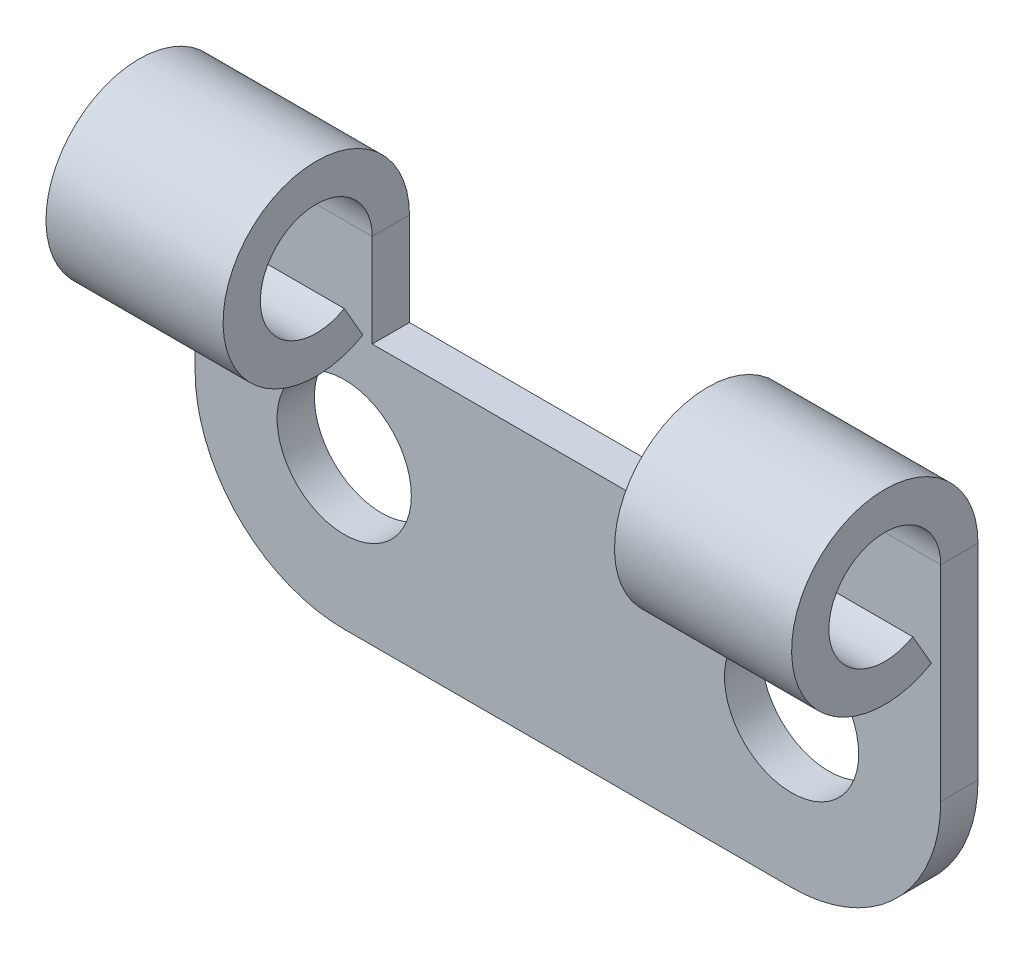
ISO-10303-21;
HEADER;
FILE_DESCRIPTION(('STEP AP214'),'2;1');
FILE_NAME('part.step','',(''),(''),'','','');
FILE_SCHEMA(('AUTOMOTIVE_DESIGN { 1 0 10303 214 1 1 1 1 }'));
ENDSEC;
DATA;
#1=APPLICATION_CONTEXT('core data for automotive mechanical design processes');
#2=APPLICATION_PROTOCOL_DEFINITION('international standard','automotive_design',2000,#1);
#3=PRODUCT_CONTEXT('',#1,'mechanical');
#4=PRODUCT('Part','Part','',(#3));
#5=PRODUCT_RELATED_PRODUCT_CATEGORY('part','',(#4));
#6=PRODUCT_DEFINITION_FORMATION('','',#4);
#7=PRODUCT_DEFINITION_CONTEXT('part definition',#1,'design');
#8=PRODUCT_DEFINITION('design','',#6,#7);
#9=PRODUCT_DEFINITION_SHAPE('','',#8);
#10=(LENGTH_UNIT() NAMED_UNIT(*) SI_UNIT(.MILLI.,.METRE.));
#11=(NAMED_UNIT(*) PLANE_ANGLE_UNIT() SI_UNIT($,.RADIAN.));
#12=(NAMED_UNIT(*) SI_UNIT($,.STERADIAN.) SOLID_ANGLE_UNIT());
#13=UNCERTAINTY_MEASURE_WITH_UNIT(LENGTH_MEASURE(1.E-05),#10,'distance_accuracy_value','');
#14=(GEOMETRIC_REPRESENTATION_CONTEXT(3) GLOBAL_UNCERTAINTY_ASSIGNED_CONTEXT((#13)) GLOBAL_UNIT_ASSIGNED_CONTEXT((#10,
#11,#12)) REPRESENTATION_CONTEXT('',''));
#15=CARTESIAN_POINT('',(0.,0.,0.));
#16=DIRECTION('',(0.,0.,1.));
#17=DIRECTION('',(1.,0.,0.));
#18=AXIS2_PLACEMENT_3D('',#15,#16,#17);
#19=CARTESIAN_POINT('',(-10.,-6.,-1.));
#20=DIRECTION('',(-1.,0.,0.));
#21=DIRECTION('',(0.,0.,1.));
#22=AXIS2_PLACEMENT_3D('',#19,#20,#21);
#23=PLANE('',#22);
#24=DIRECTION('',(0.,-1.,0.));
#25=VECTOR('',#24,1.);
#26=CARTESIAN_POINT('',(-10.,-6.,-1.));
#27=LINE('',#26,#25);
#28=CARTESIAN_POINT('',(-10.,3.5,-1.));
#29=VERTEX_POINT('',#28);
#30=CARTESIAN_POINT('',(-10.,-2.,-1.));
#31=VERTEX_POINT('',#30);
#32=EDGE_CURVE('E168',#29,#31,#27,.T.);
#33=ORIENTED_EDGE('',*,*,#32,.T.);
#34=DIRECTION('',(0.,0.,1.));
#35=VECTOR('',#34,1.);
#36=CARTESIAN_POINT('',(-10.,-2.,-1.));
#37=LINE('',#36,#35);
#38=CARTESIAN_POINT('',(-10.,-2.,0.));
#39=VERTEX_POINT('',#38);
#40=EDGE_CURVE('E199',#31,#39,#37,.T.);
#41=ORIENTED_EDGE('',*,*,#40,.T.);
#42=DIRECTION('',(0.,-1.,0.));
#43=VECTOR('',#42,1.);
#44=CARTESIAN_POINT('',(-10.,-6.,0.));
#45=LINE('',#44,#43);
#46=CARTESIAN_POINT('',(-10.,3.5,0.));
#47=VERTEX_POINT('',#46);
#48=EDGE_CURVE('E183',#47,#39,#45,.T.);
#49=ORIENTED_EDGE('',*,*,#48,.F.);
#50=DIRECTION('',(0.,0.,-1.));
#51=VECTOR('',#50,1.);
#52=CARTESIAN_POINT('',(-10.,3.5,0.));
#53=LINE('',#52,#51);
#54=EDGE_CURVE('E150',#47,#29,#53,.T.);
#55=ORIENTED_EDGE('',*,*,#54,.T.);
#56=EDGE_LOOP('',(#33,#41,#49,#55));
#57=FACE_BOUND('',#56,.T.);
#58=ADVANCED_FACE('F37',(#57),#23,.T.);
#59=CARTESIAN_POINT('',(5.25,6.,-1.));
#60=DIRECTION('',(-1.,0.,0.));
#61=DIRECTION('',(0.,0.,1.));
#62=AXIS2_PLACEMENT_3D('',#59,#60,#61);
#63=PLANE('',#62);
#64=DIRECTION('',(0.,-1.,0.));
#65=VECTOR('',#64,1.);
#66=CARTESIAN_POINT('',(5.25,6.,0.));
#67=LINE('',#66,#65);
#68=CARTESIAN_POINT('',(5.25,3.5,0.));
#69=VERTEX_POINT('',#68);
#70=CARTESIAN_POINT('',(5.25,0.999999999997891,0.));
#71=VERTEX_POINT('',#70);
#72=EDGE_CURVE('E192',#69,#71,#67,.T.);
#73=ORIENTED_EDGE('',*,*,#72,.F.);
#74=DIRECTION('',(0.,0.,-1.));
#75=VECTOR('',#74,1.);
#76=CARTESIAN_POINT('',(5.25,3.5,0.));
#77=LINE('',#76,#75);
#78=CARTESIAN_POINT('',(5.25,3.5,-1.));
#79=VERTEX_POINT('',#78);
#80=EDGE_CURVE('E243',#69,#79,#77,.T.);
#81=ORIENTED_EDGE('',*,*,#80,.T.);
#82=DIRECTION('',(0.,-1.,0.));
#83=VECTOR('',#82,1.);
#84=CARTESIAN_POINT('',(5.25,6.,-1.));
#85=LINE('',#84,#83);
#86=CARTESIAN_POINT('',(5.25,0.999999999997891,-1.));
#87=VERTEX_POINT('',#86);
#88=EDGE_CURVE('E179',#79,#87,#85,.T.);
#89=ORIENTED_EDGE('',*,*,#88,.T.);
#90=DIRECTION('',(0.,0.,1.));
#91=VECTOR('',#90,1.);
#92=CARTESIAN_POINT('',(5.25,0.999999999997891,-1.));
#93=LINE('',#92,#91);
#94=EDGE_CURVE('E174',#87,#71,#93,.T.);
#95=ORIENTED_EDGE('',*,*,#94,.T.);
#96=EDGE_LOOP('',(#73,#81,#89,#95));
#97=FACE_BOUND('',#96,.T.);
#98=ADVANCED_FACE('F259',(#97),#63,.T.);
#99=CARTESIAN_POINT('',(-5.25,0.99999999999789,-1.));
#100=DIRECTION('',(1.,0.,0.));
#101=DIRECTION('',(0.,1.,0.));
#102=AXIS2_PLACEMENT_3D('',#99,#100,#101);
#103=PLANE('',#102);
#104=DIRECTION('',(0.,0.,-1.));
#105=VECTOR('',#104,1.);
#106=CARTESIAN_POINT('',(-5.25,3.5,0.));
#107=LINE('',#106,#105);
#108=CARTESIAN_POINT('',(-5.25,3.5,0.));
#109=VERTEX_POINT('',#108);
#110=CARTESIAN_POINT('',(-5.25,3.5,-1.));
#111=VERTEX_POINT('',#110);
#112=EDGE_CURVE('E139',#109,#111,#107,.T.);
#113=ORIENTED_EDGE('',*,*,#112,.F.);
#114=DIRECTION('',(0.,1.,0.));
#115=VECTOR('',#114,1.);
#116=CARTESIAN_POINT('',(-5.25,0.99999999999789,0.));
#117=LINE('',#116,#115);
#118=CARTESIAN_POINT('',(-5.25,0.99999999999789,0.));
#119=VERTEX_POINT('',#118);
#120=EDGE_CURVE('E197',#119,#109,#117,.T.);
#121=ORIENTED_EDGE('',*,*,#120,.F.);
#122=DIRECTION('',(0.,0.,1.));
#123=VECTOR('',#122,1.);
#124=CARTESIAN_POINT('',(-5.25,0.99999999999789,-1.));
#125=LINE('',#124,#123);
#126=CARTESIAN_POINT('',(-5.25,0.99999999999789,-1.));
#127=VERTEX_POINT('',#126);
#128=EDGE_CURVE('E172',#127,#119,#125,.T.);
#129=ORIENTED_EDGE('',*,*,#128,.F.);
#130=DIRECTION('',(0.,1.,0.));
#131=VECTOR('',#130,1.);
#132=CARTESIAN_POINT('',(-5.25,0.99999999999789,-1.));
#133=LINE('',#132,#131);
#134=EDGE_CURVE('E166',#127,#111,#133,.T.);
#135=ORIENTED_EDGE('',*,*,#134,.T.);
#136=EDGE_LOOP('',(#113,#121,#129,#135));
#137=FACE_BOUND('',#136,.T.);
#138=ADVANCED_FACE('F171',(#137),#103,.T.);
#139=CARTESIAN_POINT('',(5.25,0.999999999997891,-1.));
#140=DIRECTION('',(0.,1.,0.));
#141=DIRECTION('',(-1.,0.,0.));
#142=AXIS2_PLACEMENT_3D('',#139,#140,#141);
#143=PLANE('',#142);
#144=DIRECTION('',(-1.,0.,0.));
#145=VECTOR('',#144,1.);
#146=CARTESIAN_POINT('',(5.25,0.999999999997891,0.));
#147=LINE('',#146,#145);
#148=EDGE_CURVE('E194',#71,#119,#147,.T.);
#149=ORIENTED_EDGE('',*,*,#148,.F.);
#150=ORIENTED_EDGE('',*,*,#94,.F.);
#151=DIRECTION('',(-1.,0.,0.));
#152=VECTOR('',#151,1.);
#153=CARTESIAN_POINT('',(5.25,0.999999999997891,-1.));
#154=LINE('',#153,#152);
#155=EDGE_CURVE('E175',#87,#127,#154,.T.);
#156=ORIENTED_EDGE('',*,*,#155,.T.);
#157=ORIENTED_EDGE('',*,*,#128,.T.);
#158=EDGE_LOOP('',(#149,#150,#156,#157));
#159=FACE_BOUND('',#158,.T.);
#160=ADVANCED_FACE('F264',(#159),#143,.T.);
#161=CARTESIAN_POINT('',(10.,-6.,-1.));
#162=DIRECTION('',(1.,0.,0.));
#163=DIRECTION('',(0.,0.,-1.));
#164=AXIS2_PLACEMENT_3D('',#161,#162,#163);
#165=PLANE('',#164);
#166=DIRECTION('',(0.,1.,0.));
#167=VECTOR('',#166,1.);
#168=CARTESIAN_POINT('',(10.,-6.,0.));
#169=LINE('',#168,#167);
#170=CARTESIAN_POINT('',(10.,-2.,0.));
#171=VERTEX_POINT('',#170);
#172=CARTESIAN_POINT('',(10.,3.5,0.));
#173=VERTEX_POINT('',#172);
#174=EDGE_CURVE('E190',#171,#173,#169,.T.);
#175=ORIENTED_EDGE('',*,*,#174,.F.);
#176=DIRECTION('',(0.,0.,1.));
#177=VECTOR('',#176,1.);
#178=CARTESIAN_POINT('',(10.,-2.,-1.));
#179=LINE('',#178,#177);
#180=CARTESIAN_POINT('',(10.,-2.,-1.));
#181=VERTEX_POINT('',#180);
#182=EDGE_CURVE('E11',#171,#181,#179,.F.);
#183=ORIENTED_EDGE('',*,*,#182,.T.);
#184=DIRECTION('',(0.,1.,0.));
#185=VECTOR('',#184,1.);
#186=CARTESIAN_POINT('',(10.,-6.,-1.));
#187=LINE('',#186,#185);
#188=CARTESIAN_POINT('',(10.,3.5,-1.));
#189=VERTEX_POINT('',#188);
#190=EDGE_CURVE('E237',#181,#189,#187,.T.);
#191=ORIENTED_EDGE('',*,*,#190,.T.);
#192=DIRECTION('',(0.,0.,-1.));
#193=VECTOR('',#192,1.);
#194=CARTESIAN_POINT('',(10.,3.5,0.));
#195=LINE('',#194,#193);
#196=EDGE_CURVE('E236',#173,#189,#195,.T.);
#197=ORIENTED_EDGE('',*,*,#196,.F.);
#198=EDGE_LOOP('',(#175,#183,#191,#197));
#199=FACE_BOUND('',#198,.T.);
#200=ADVANCED_FACE('F234',(#199),#165,.T.);
#201=CARTESIAN_POINT('',(10.,-6.,-1.));
#202=DIRECTION('',(0.,-1.,0.));
#203=DIRECTION('',(1.,0.,0.));
#204=AXIS2_PLACEMENT_3D('',#201,#202,#203);
#205=PLANE('',#204);
#206=DIRECTION('',(1.,0.,0.));
#207=VECTOR('',#206,1.);
#208=CARTESIAN_POINT('',(10.,-6.,0.));
#209=LINE('',#208,#207);
#210=CARTESIAN_POINT('',(-6.,-6.,0.));
#211=VERTEX_POINT('',#210);
#212=CARTESIAN_POINT('',(6.,-6.,0.));
#213=VERTEX_POINT('',#212);
#214=EDGE_CURVE('E186',#211,#213,#209,.T.);
#215=ORIENTED_EDGE('',*,*,#214,.F.);
#216=DIRECTION('',(0.,0.,1.));
#217=VECTOR('',#216,1.);
#218=CARTESIAN_POINT('',(-6.,-6.,-1.));
#219=LINE('',#218,#217);
#220=CARTESIAN_POINT('',(-6.,-6.,-1.));
#221=VERTEX_POINT('',#220);
#222=EDGE_CURVE('E210',#211,#221,#219,.F.);
#223=ORIENTED_EDGE('',*,*,#222,.T.);
#224=DIRECTION('',(1.,0.,0.));
#225=VECTOR('',#224,1.);
#226=CARTESIAN_POINT('',(10.,-6.,-1.));
#227=LINE('',#226,#225);
#228=CARTESIAN_POINT('',(6.,-6.,-1.));
#229=VERTEX_POINT('',#228);
#230=EDGE_CURVE('E213',#221,#229,#227,.T.);
#231=ORIENTED_EDGE('',*,*,#230,.T.);
#232=DIRECTION('',(0.,0.,1.));
#233=VECTOR('',#232,1.);
#234=CARTESIAN_POINT('',(6.,-6.,-1.));
#235=LINE('',#234,#233);
#236=EDGE_CURVE('E207',#229,#213,#235,.T.);
#237=ORIENTED_EDGE('',*,*,#236,.T.);
#238=EDGE_LOOP('',(#215,#223,#231,#237));
#239=FACE_BOUND('',#238,.T.);
#240=ADVANCED_FACE('F228',(#239),#205,.T.);
#241=CARTESIAN_POINT('',(0.,0.,-1.));
#242=DIRECTION('',(0.,0.,-1.));
#243=DIRECTION('',(-1.,0.,0.));
#244=AXIS2_PLACEMENT_3D('',#241,#242,#243);
#245=PLANE('',#244);
#246=CARTESIAN_POINT('',(6.,-2.,-1.));
#247=DIRECTION('',(0.,0.,1.));
#248=DIRECTION('',(1.,0.,0.));
#249=AXIS2_PLACEMENT_3D('',#246,#247,#248);
#250=CIRCLE('',#249,1.8);
#251=CARTESIAN_POINT('',(7.8,-2.,-1.));
#252=VERTEX_POINT('',#251);
#253=EDGE_CURVE('E302',#252,#252,#250,.T.);
#254=ORIENTED_EDGE('',*,*,#253,.T.);
#255=EDGE_LOOP('',(#254));
#256=FACE_BOUND('',#255,.T.);
#257=CARTESIAN_POINT('',(-6.,-2.,-1.));
#258=DIRECTION('',(0.,0.,1.));
#259=DIRECTION('',(1.,0.,0.));
#260=AXIS2_PLACEMENT_3D('',#257,#258,#259);
#261=CIRCLE('',#260,1.8);
#262=CARTESIAN_POINT('',(-4.2,-2.,-1.));
#263=VERTEX_POINT('',#262);
#264=EDGE_CURVE('E290',#263,#263,#261,.T.);
#265=ORIENTED_EDGE('',*,*,#264,.T.);
#266=EDGE_LOOP('',(#265));
#267=FACE_BOUND('',#266,.T.);
#268=ORIENTED_EDGE('',*,*,#230,.F.);
#269=CARTESIAN_POINT('',(-6.,-2.,-1.));
#270=DIRECTION('',(0.,0.,-1.));
#271=DIRECTION('',(-1.,0.,0.));
#272=AXIS2_PLACEMENT_3D('',#269,#270,#271);
#273=CIRCLE('',#272,4.);
#274=EDGE_CURVE('E45',#221,#31,#273,.T.);
#275=ORIENTED_EDGE('',*,*,#274,.T.);
#276=ORIENTED_EDGE('',*,*,#32,.F.);
#277=DIRECTION('',(-1.,0.,0.));
#278=VECTOR('',#277,1.);
#279=CARTESIAN_POINT('',(-10.,3.5,-1.));
#280=LINE('',#279,#278);
#281=EDGE_CURVE('E157',#29,#111,#280,.F.);
#282=ORIENTED_EDGE('',*,*,#281,.T.);
#283=ORIENTED_EDGE('',*,*,#134,.F.);
#284=ORIENTED_EDGE('',*,*,#155,.F.);
#285=ORIENTED_EDGE('',*,*,#88,.F.);
#286=DIRECTION('',(-1.,0.,0.));
#287=VECTOR('',#286,1.);
#288=CARTESIAN_POINT('',(5.25,3.5,-1.));
#289=LINE('',#288,#287);
#290=EDGE_CURVE('E277',#79,#189,#289,.F.);
#291=ORIENTED_EDGE('',*,*,#290,.T.);
#292=ORIENTED_EDGE('',*,*,#190,.F.);
#293=CARTESIAN_POINT('',(6.,-2.,-1.));
#294=DIRECTION('',(0.,0.,-1.));
#295=DIRECTION('',(-1.,0.,0.));
#296=AXIS2_PLACEMENT_3D('',#293,#294,#295);
#297=CIRCLE('',#296,4.);
#298=EDGE_CURVE('E57',#181,#229,#297,.T.);
#299=ORIENTED_EDGE('',*,*,#298,.T.);
#300=EDGE_LOOP('',(#268,#275,#276,#282,#283,#284,#285,#291,#292,#299));
#301=FACE_BOUND('',#300,.T.);
#302=ADVANCED_FACE('F164',(#256,#267,#301),#245,.T.);
#303=CARTESIAN_POINT('',(0.,0.,0.));
#304=DIRECTION('',(0.,0.,-1.));
#305=DIRECTION('',(-1.,0.,0.));
#306=AXIS2_PLACEMENT_3D('',#303,#304,#305);
#307=PLANE('',#306);
#308=CARTESIAN_POINT('',(6.,-2.,0.));
#309=DIRECTION('',(0.,0.,1.));
#310=DIRECTION('',(1.,0.,0.));
#311=AXIS2_PLACEMENT_3D('',#308,#309,#310);
#312=CIRCLE('',#311,1.8);
#313=CARTESIAN_POINT('',(7.8,-2.,0.));
#314=VERTEX_POINT('',#313);
#315=EDGE_CURVE('E305',#314,#314,#312,.T.);
#316=ORIENTED_EDGE('',*,*,#315,.F.);
#317=EDGE_LOOP('',(#316));
#318=FACE_BOUND('',#317,.T.);
#319=CARTESIAN_POINT('',(-6.,-2.,0.));
#320=DIRECTION('',(0.,0.,1.));
#321=DIRECTION('',(1.,0.,0.));
#322=AXIS2_PLACEMENT_3D('',#319,#320,#321);
#323=CIRCLE('',#322,1.8);
#324=CARTESIAN_POINT('',(-4.2,-2.,0.));
#325=VERTEX_POINT('',#324);
#326=EDGE_CURVE('E299',#325,#325,#323,.T.);
#327=ORIENTED_EDGE('',*,*,#326,.F.);
#328=EDGE_LOOP('',(#327));
#329=FACE_BOUND('',#328,.T.);
#330=ORIENTED_EDGE('',*,*,#48,.T.);
#331=CARTESIAN_POINT('',(-6.,-2.,0.));
#332=DIRECTION('',(0.,0.,-1.));
#333=DIRECTION('',(-1.,0.,0.));
#334=AXIS2_PLACEMENT_3D('',#331,#332,#333);
#335=CIRCLE('',#334,4.);
#336=EDGE_CURVE('E205',#39,#211,#335,.F.);
#337=ORIENTED_EDGE('',*,*,#336,.T.);
#338=ORIENTED_EDGE('',*,*,#214,.T.);
#339=CARTESIAN_POINT('',(6.,-2.,0.));
#340=DIRECTION('',(0.,0.,-1.));
#341=DIRECTION('',(-1.,0.,0.));
#342=AXIS2_PLACEMENT_3D('',#339,#340,#341);
#343=CIRCLE('',#342,4.);
#344=EDGE_CURVE('E203',#213,#171,#343,.F.);
#345=ORIENTED_EDGE('',*,*,#344,.T.);
#346=ORIENTED_EDGE('',*,*,#174,.T.);
#347=DIRECTION('',(-1.,0.,0.));
#348=VECTOR('',#347,1.);
#349=CARTESIAN_POINT('',(5.25,3.5,0.));
#350=LINE('',#349,#348);
#351=EDGE_CURVE('E265',#69,#173,#350,.F.);
#352=ORIENTED_EDGE('',*,*,#351,.F.);
#353=ORIENTED_EDGE('',*,*,#72,.T.);
#354=ORIENTED_EDGE('',*,*,#148,.T.);
#355=ORIENTED_EDGE('',*,*,#120,.T.);
#356=DIRECTION('',(-1.,0.,0.));
#357=VECTOR('',#356,1.);
#358=CARTESIAN_POINT('',(-10.,3.5,0.));
#359=LINE('',#358,#357);
#360=EDGE_CURVE('E292',#47,#109,#359,.F.);
#361=ORIENTED_EDGE('',*,*,#360,.F.);
#362=EDGE_LOOP('',(#330,#337,#338,#345,#346,#352,#353,#354,#355,#361));
#363=FACE_BOUND('',#362,.T.);
#364=ADVANCED_FACE('F225',(#318,#329,#363),#307,.F.);
#365=CARTESIAN_POINT('',(7.625,2.20096189432335,0.749999999999985));
#366=DIRECTION('',(0.,-0.50000000000001,0.866025403784433));
#367=DIRECTION('',(-1.,0.,0.));
#368=AXIS2_PLACEMENT_3D('',#365,#366,#367);
#369=PLANE('',#368);
#370=DIRECTION('',(0.,-0.866025403784433,-0.50000000000001));
#371=VECTOR('',#370,1.);
#372=CARTESIAN_POINT('',(5.25,2.20096189432335,0.749999999999985));
#373=LINE('',#372,#371);
#374=CARTESIAN_POINT('',(5.25,2.20096189432335,0.749999999999985));
#375=VERTEX_POINT('',#374);
#376=CARTESIAN_POINT('',(5.25,1.33493649053892,0.249999999999975));
#377=VERTEX_POINT('',#376);
#378=EDGE_CURVE('E187',#375,#377,#373,.T.);
#379=ORIENTED_EDGE('',*,*,#378,.F.);
#380=DIRECTION('',(-1.,0.,0.));
#381=VECTOR('',#380,1.);
#382=CARTESIAN_POINT('',(5.25,2.20096189432335,0.749999999999985));
#383=LINE('',#382,#381);
#384=CARTESIAN_POINT('',(10.,2.20096189432335,0.749999999999985));
#385=VERTEX_POINT('',#384);
#386=EDGE_CURVE('E250',#385,#375,#383,.T.);
#387=ORIENTED_EDGE('',*,*,#386,.F.);
#388=DIRECTION('',(0.,-0.866025403784433,-0.50000000000001));
#389=VECTOR('',#388,1.);
#390=CARTESIAN_POINT('',(10.,2.20096189432335,0.749999999999985));
#391=LINE('',#390,#389);
#392=CARTESIAN_POINT('',(10.,1.33493649053892,0.249999999999975));
#393=VERTEX_POINT('',#392);
#394=EDGE_CURVE('E242',#385,#393,#391,.T.);
#395=ORIENTED_EDGE('',*,*,#394,.T.);
#396=DIRECTION('',(-1.,0.,0.));
#397=VECTOR('',#396,1.);
#398=CARTESIAN_POINT('',(5.25,1.33493649053892,0.249999999999975));
#399=LINE('',#398,#397);
#400=EDGE_CURVE('E271',#393,#377,#399,.T.);
#401=ORIENTED_EDGE('',*,*,#400,.T.);
#402=EDGE_LOOP('',(#379,#387,#395,#401));
#403=FACE_BOUND('',#402,.T.);
#404=ADVANCED_FACE('F313',(#403),#369,.F.);
#405=CARTESIAN_POINT('',(10.,3.5,1.5));
#406=DIRECTION('',(1.,0.,0.));
#407=DIRECTION('',(0.,1.,0.));
#408=AXIS2_PLACEMENT_3D('',#405,#406,#407);
#409=PLANE('',#408);
#410=ORIENTED_EDGE('',*,*,#394,.F.);
#411=CARTESIAN_POINT('',(10.,3.5,1.5));
#412=DIRECTION('',(-1.,0.,0.));
#413=DIRECTION('',(0.,-1.,0.));
#414=AXIS2_PLACEMENT_3D('',#411,#412,#413);
#415=CIRCLE('',#414,1.5);
#416=EDGE_CURVE('E268',#173,#385,#415,.F.);
#417=ORIENTED_EDGE('',*,*,#416,.F.);
#418=ORIENTED_EDGE('',*,*,#196,.T.);
#419=CARTESIAN_POINT('',(10.,3.5,1.5));
#420=DIRECTION('',(-1.,0.,0.));
#421=DIRECTION('',(0.,-1.,0.));
#422=AXIS2_PLACEMENT_3D('',#419,#420,#421);
#423=CIRCLE('',#422,2.5);
#424=EDGE_CURVE('E247',#189,#393,#423,.F.);
#425=ORIENTED_EDGE('',*,*,#424,.T.);
#426=EDGE_LOOP('',(#410,#417,#418,#425));
#427=FACE_BOUND('',#426,.T.);
#428=ADVANCED_FACE('F366',(#427),#409,.T.);
#429=CARTESIAN_POINT('',(5.25,3.5,1.5));
#430=DIRECTION('',(1.,0.,0.));
#431=DIRECTION('',(0.,1.,0.));
#432=AXIS2_PLACEMENT_3D('',#429,#430,#431);
#433=PLANE('',#432);
#434=CARTESIAN_POINT('',(5.25,3.5,1.5));
#435=DIRECTION('',(-1.,0.,0.));
#436=DIRECTION('',(0.,-1.,0.));
#437=AXIS2_PLACEMENT_3D('',#434,#435,#436);
#438=CIRCLE('',#437,1.5);
#439=EDGE_CURVE('E269',#375,#69,#438,.T.);
#440=ORIENTED_EDGE('',*,*,#439,.F.);
#441=ORIENTED_EDGE('',*,*,#378,.T.);
#442=CARTESIAN_POINT('',(5.25,3.5,1.5));
#443=DIRECTION('',(-1.,0.,0.));
#444=DIRECTION('',(0.,-1.,0.));
#445=AXIS2_PLACEMENT_3D('',#442,#443,#444);
#446=CIRCLE('',#445,2.5);
#447=EDGE_CURVE('E274',#377,#79,#446,.T.);
#448=ORIENTED_EDGE('',*,*,#447,.T.);
#449=ORIENTED_EDGE('',*,*,#80,.F.);
#450=EDGE_LOOP('',(#440,#441,#448,#449));
#451=FACE_BOUND('',#450,.T.);
#452=ADVANCED_FACE('F362',(#451),#433,.F.);
#453=CARTESIAN_POINT('',(5.25,3.5,1.5));
#454=DIRECTION('',(-1.,0.,0.));
#455=DIRECTION('',(0.,-0.866025403784433,-0.50000000000001));
#456=AXIS2_PLACEMENT_3D('',#453,#454,#455);
#457=CYLINDRICAL_SURFACE('',#456,2.5);
#458=ORIENTED_EDGE('',*,*,#290,.F.);
#459=ORIENTED_EDGE('',*,*,#447,.F.);
#460=ORIENTED_EDGE('',*,*,#400,.F.);
#461=ORIENTED_EDGE('',*,*,#424,.F.);
#462=EDGE_LOOP('',(#458,#459,#460,#461));
#463=FACE_BOUND('',#462,.T.);
#464=ADVANCED_FACE('F359',(#463),#457,.T.);
#465=CARTESIAN_POINT('',(5.25,3.5,1.5));
#466=DIRECTION('',(-1.,0.,0.));
#467=DIRECTION('',(0.,-0.866025403784433,-0.50000000000001));
#468=AXIS2_PLACEMENT_3D('',#465,#466,#467);
#469=CYLINDRICAL_SURFACE('',#468,1.5);
#470=ORIENTED_EDGE('',*,*,#351,.T.);
#471=ORIENTED_EDGE('',*,*,#416,.T.);
#472=ORIENTED_EDGE('',*,*,#386,.T.);
#473=ORIENTED_EDGE('',*,*,#439,.T.);
#474=EDGE_LOOP('',(#470,#471,#472,#473));
#475=FACE_BOUND('',#474,.T.);
#476=ADVANCED_FACE('F354',(#475),#469,.F.);
#477=CARTESIAN_POINT('',(-7.625,2.20096189432335,0.749999999999985));
#478=DIRECTION('',(0.,-0.50000000000001,0.866025403784433));
#479=DIRECTION('',(-1.,0.,0.));
#480=AXIS2_PLACEMENT_3D('',#477,#478,#479);
#481=PLANE('',#480);
#482=DIRECTION('',(0.,-0.866025403784433,-0.50000000000001));
#483=VECTOR('',#482,1.);
#484=CARTESIAN_POINT('',(-10.,2.20096189432335,0.749999999999985));
#485=LINE('',#484,#483);
#486=CARTESIAN_POINT('',(-10.,2.20096189432335,0.749999999999985));
#487=VERTEX_POINT('',#486);
#488=CARTESIAN_POINT('',(-10.,1.33493649053892,0.249999999999975));
#489=VERTEX_POINT('',#488);
#490=EDGE_CURVE('E283',#487,#489,#485,.T.);
#491=ORIENTED_EDGE('',*,*,#490,.F.);
#492=DIRECTION('',(-1.,0.,0.));
#493=VECTOR('',#492,1.);
#494=CARTESIAN_POINT('',(-10.,2.20096189432335,0.749999999999985));
#495=LINE('',#494,#493);
#496=CARTESIAN_POINT('',(-5.25,2.20096189432335,0.749999999999985));
#497=VERTEX_POINT('',#496);
#498=EDGE_CURVE('E286',#497,#487,#495,.T.);
#499=ORIENTED_EDGE('',*,*,#498,.F.);
#500=DIRECTION('',(0.,-0.866025403784433,-0.50000000000001));
#501=VECTOR('',#500,1.);
#502=CARTESIAN_POINT('',(-5.25,2.20096189432335,0.749999999999985));
#503=LINE('',#502,#501);
#504=CARTESIAN_POINT('',(-5.25,1.33493649053892,0.249999999999975));
#505=VERTEX_POINT('',#504);
#506=EDGE_CURVE('E149',#497,#505,#503,.T.);
#507=ORIENTED_EDGE('',*,*,#506,.T.);
#508=DIRECTION('',(-1.,0.,0.));
#509=VECTOR('',#508,1.);
#510=CARTESIAN_POINT('',(-10.,1.33493649053892,0.249999999999975));
#511=LINE('',#510,#509);
#512=EDGE_CURVE('E160',#505,#489,#511,.T.);
#513=ORIENTED_EDGE('',*,*,#512,.T.);
#514=EDGE_LOOP('',(#491,#499,#507,#513));
#515=FACE_BOUND('',#514,.T.);
#516=ADVANCED_FACE('F351',(#515),#481,.F.);
#517=CARTESIAN_POINT('',(-5.25,3.5,1.5));
#518=DIRECTION('',(1.,0.,0.));
#519=DIRECTION('',(0.,0.,-1.));
#520=AXIS2_PLACEMENT_3D('',#517,#518,#519);
#521=PLANE('',#520);
#522=ORIENTED_EDGE('',*,*,#506,.F.);
#523=CARTESIAN_POINT('',(-5.25,3.5,1.5));
#524=DIRECTION('',(-1.,0.,0.));
#525=DIRECTION('',(0.,0.,1.));
#526=AXIS2_PLACEMENT_3D('',#523,#524,#525);
#527=CIRCLE('',#526,1.5);
#528=EDGE_CURVE('E144',#109,#497,#527,.F.);
#529=ORIENTED_EDGE('',*,*,#528,.F.);
#530=ORIENTED_EDGE('',*,*,#112,.T.);
#531=CARTESIAN_POINT('',(-5.25,3.5,1.5));
#532=DIRECTION('',(-1.,0.,0.));
#533=DIRECTION('',(0.,0.,1.));
#534=AXIS2_PLACEMENT_3D('',#531,#532,#533);
#535=CIRCLE('',#534,2.5);
#536=EDGE_CURVE('E142',#111,#505,#535,.F.);
#537=ORIENTED_EDGE('',*,*,#536,.T.);
#538=EDGE_LOOP('',(#522,#529,#530,#537));
#539=FACE_BOUND('',#538,.T.);
#540=ADVANCED_FACE('F141',(#539),#521,.T.);
#541=CARTESIAN_POINT('',(-10.,3.5,1.5));
#542=DIRECTION('',(1.,0.,0.));
#543=DIRECTION('',(0.,0.,-1.));
#544=AXIS2_PLACEMENT_3D('',#541,#542,#543);
#545=PLANE('',#544);
#546=CARTESIAN_POINT('',(-10.,3.5,1.5));
#547=DIRECTION('',(-1.,0.,0.));
#548=DIRECTION('',(0.,0.,1.));
#549=AXIS2_PLACEMENT_3D('',#546,#547,#548);
#550=CIRCLE('',#549,1.5);
#551=EDGE_CURVE('E289',#487,#47,#550,.T.);
#552=ORIENTED_EDGE('',*,*,#551,.F.);
#553=ORIENTED_EDGE('',*,*,#490,.T.);
#554=CARTESIAN_POINT('',(-10.,3.5,1.5));
#555=DIRECTION('',(-1.,0.,0.));
#556=DIRECTION('',(0.,0.,1.));
#557=AXIS2_PLACEMENT_3D('',#554,#555,#556);
#558=CIRCLE('',#557,2.5);
#559=EDGE_CURVE('E169',#489,#29,#558,.T.);
#560=ORIENTED_EDGE('',*,*,#559,.T.);
#561=ORIENTED_EDGE('',*,*,#54,.F.);
#562=EDGE_LOOP('',(#552,#553,#560,#561));
#563=FACE_BOUND('',#562,.T.);
#564=ADVANCED_FACE('F347',(#563),#545,.F.);
#565=CARTESIAN_POINT('',(-10.,3.5,1.5));
#566=DIRECTION('',(-1.,0.,0.));
#567=DIRECTION('',(0.,-0.866025403784433,-0.50000000000001));
#568=AXIS2_PLACEMENT_3D('',#565,#566,#567);
#569=CYLINDRICAL_SURFACE('',#568,2.5);
#570=ORIENTED_EDGE('',*,*,#281,.F.);
#571=ORIENTED_EDGE('',*,*,#559,.F.);
#572=ORIENTED_EDGE('',*,*,#512,.F.);
#573=ORIENTED_EDGE('',*,*,#536,.F.);
#574=EDGE_LOOP('',(#570,#571,#572,#573));
#575=FACE_BOUND('',#574,.T.);
#576=ADVANCED_FACE('F155',(#575),#569,.T.);
#577=CARTESIAN_POINT('',(-10.,3.5,1.5));
#578=DIRECTION('',(-1.,0.,0.));
#579=DIRECTION('',(0.,-0.866025403784433,-0.50000000000001));
#580=AXIS2_PLACEMENT_3D('',#577,#578,#579);
#581=CYLINDRICAL_SURFACE('',#580,1.5);
#582=ORIENTED_EDGE('',*,*,#360,.T.);
#583=ORIENTED_EDGE('',*,*,#528,.T.);
#584=ORIENTED_EDGE('',*,*,#498,.T.);
#585=ORIENTED_EDGE('',*,*,#551,.T.);
#586=EDGE_LOOP('',(#582,#583,#584,#585));
#587=FACE_BOUND('',#586,.T.);
#588=ADVANCED_FACE('F338',(#587),#581,.F.);
#589=CARTESIAN_POINT('',(-6.,-2.,-1.));
#590=DIRECTION('',(0.,0.,1.));
#591=DIRECTION('',(1.,0.,0.));
#592=AXIS2_PLACEMENT_3D('',#589,#590,#591);
#593=CYLINDRICAL_SURFACE('',#592,4.);
#594=ORIENTED_EDGE('',*,*,#274,.F.);
#595=ORIENTED_EDGE('',*,*,#222,.F.);
#596=ORIENTED_EDGE('',*,*,#336,.F.);
#597=ORIENTED_EDGE('',*,*,#40,.F.);
#598=EDGE_LOOP('',(#594,#595,#596,#597));
#599=FACE_BOUND('',#598,.T.);
#600=ADVANCED_FACE('F222',(#599),#593,.T.);
#601=CARTESIAN_POINT('',(6.,-2.,-1.));
#602=DIRECTION('',(0.,0.,1.));
#603=DIRECTION('',(1.,0.,0.));
#604=AXIS2_PLACEMENT_3D('',#601,#602,#603);
#605=CYLINDRICAL_SURFACE('',#604,4.);
#606=ORIENTED_EDGE('',*,*,#298,.F.);
#607=ORIENTED_EDGE('',*,*,#182,.F.);
#608=ORIENTED_EDGE('',*,*,#344,.F.);
#609=ORIENTED_EDGE('',*,*,#236,.F.);
#610=EDGE_LOOP('',(#606,#607,#608,#609));
#611=FACE_BOUND('',#610,.T.);
#612=ADVANCED_FACE('F39',(#611),#605,.T.);
#613=CARTESIAN_POINT('',(-6.,-2.,0.));
#614=DIRECTION('',(0.,0.,1.));
#615=DIRECTION('',(1.,0.,0.));
#616=AXIS2_PLACEMENT_3D('',#613,#614,#615);
#617=CYLINDRICAL_SURFACE('',#616,1.8);
#618=ORIENTED_EDGE('',*,*,#264,.F.);
#619=EDGE_LOOP('',(#618));
#620=FACE_BOUND('',#619,.T.);
#621=ORIENTED_EDGE('',*,*,#326,.T.);
#622=EDGE_LOOP('',(#621));
#623=FACE_BOUND('',#622,.T.);
#624=ADVANCED_FACE('F317',(#620,#623),#617,.F.);
#625=CARTESIAN_POINT('',(6.,-2.,0.));
#626=DIRECTION('',(0.,0.,1.));
#627=DIRECTION('',(1.,0.,0.));
#628=AXIS2_PLACEMENT_3D('',#625,#626,#627);
#629=CYLINDRICAL_SURFACE('',#628,1.8);
#630=ORIENTED_EDGE('',*,*,#253,.F.);
#631=EDGE_LOOP('',(#630));
#632=FACE_BOUND('',#631,.T.);
#633=ORIENTED_EDGE('',*,*,#315,.T.);
#634=EDGE_LOOP('',(#633));
#635=FACE_BOUND('',#634,.T.);
#636=ADVANCED_FACE('F309',(#632,#635),#629,.F.);
#637=CLOSED_SHELL('',(#58,#98,#138,#160,#200,#240,#302,#364,#404,#428,#452,#464,#476,#516,#540,
#564,#576,#588,#600,#612,#624,#636));
#638=MANIFOLD_SOLID_BREP('B2',#637);
#639=ADVANCED_BREP_SHAPE_REPRESENTATION('',(#18,#638),#14);
#640=SHAPE_DEFINITION_REPRESENTATION(#9,#639);
ENDSEC;
END-ISO-10303-21;
